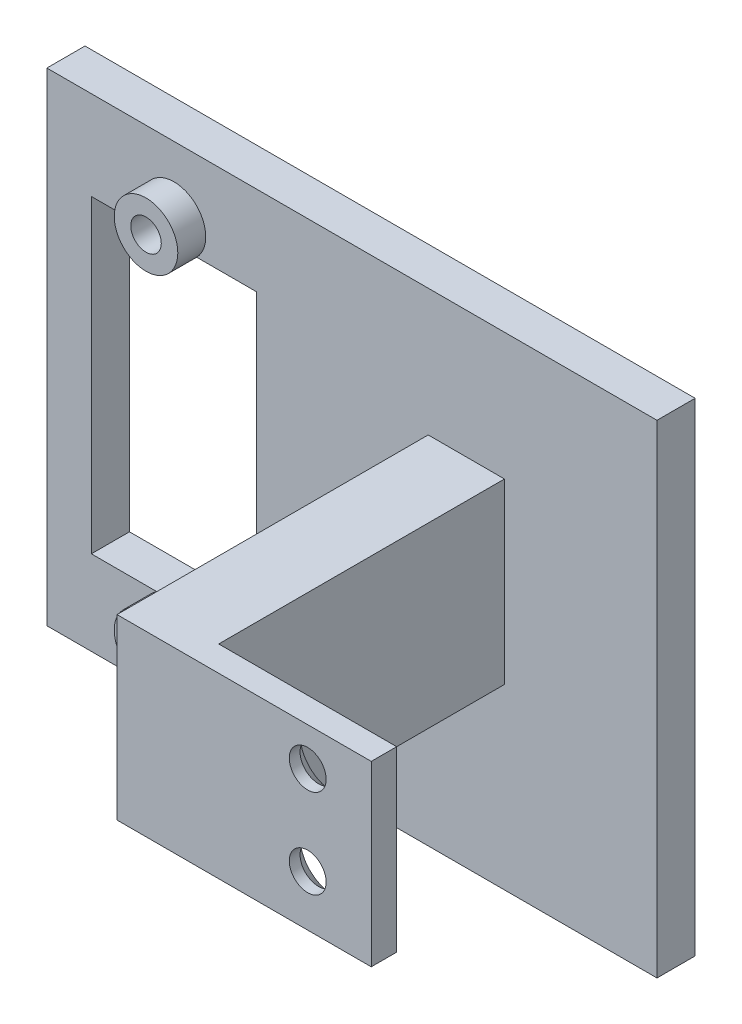
ISO-10303-21;
HEADER;
FILE_DESCRIPTION(('STEP AP214'),'2;1');
FILE_NAME('part.step','',(''),(''),'','','');
FILE_SCHEMA(('AUTOMOTIVE_DESIGN { 1 0 10303 214 1 1 1 1 }'));
ENDSEC;
DATA;
#1=APPLICATION_CONTEXT('core data for automotive mechanical design processes');
#2=APPLICATION_PROTOCOL_DEFINITION('international standard','automotive_design',2000,#1);
#3=PRODUCT_CONTEXT('',#1,'mechanical');
#4=PRODUCT('Part','Part','',(#3));
#5=PRODUCT_RELATED_PRODUCT_CATEGORY('part','',(#4));
#6=PRODUCT_DEFINITION_FORMATION('','',#4);
#7=PRODUCT_DEFINITION_CONTEXT('part definition',#1,'design');
#8=PRODUCT_DEFINITION('design','',#6,#7);
#9=PRODUCT_DEFINITION_SHAPE('','',#8);
#10=(LENGTH_UNIT() NAMED_UNIT(*) SI_UNIT(.MILLI.,.METRE.));
#11=(NAMED_UNIT(*) PLANE_ANGLE_UNIT() SI_UNIT($,.RADIAN.));
#12=(NAMED_UNIT(*) SI_UNIT($,.STERADIAN.) SOLID_ANGLE_UNIT());
#13=UNCERTAINTY_MEASURE_WITH_UNIT(LENGTH_MEASURE(1.E-05),#10,'distance_accuracy_value','');
#14=(GEOMETRIC_REPRESENTATION_CONTEXT(3) GLOBAL_UNCERTAINTY_ASSIGNED_CONTEXT((#13)) GLOBAL_UNIT_ASSIGNED_CONTEXT((#10,
#11,#12)) REPRESENTATION_CONTEXT('',''));
#15=CARTESIAN_POINT('',(0.,0.,0.));
#16=DIRECTION('',(0.,0.,1.));
#17=DIRECTION('',(1.,0.,0.));
#18=AXIS2_PLACEMENT_3D('',#15,#16,#17);
#19=CARTESIAN_POINT('',(-25.,25.,0.01));
#20=DIRECTION('',(0.,0.,-1.));
#21=DIRECTION('',(-1.,0.,0.));
#22=AXIS2_PLACEMENT_3D('',#19,#20,#21);
#23=CYLINDRICAL_SURFACE('',#22,1.45);
#24=CARTESIAN_POINT('',(-25.,25.,0.));
#25=DIRECTION('',(0.,0.,-1.));
#26=DIRECTION('',(-1.,0.,0.));
#27=AXIS2_PLACEMENT_3D('',#24,#25,#26);
#28=CIRCLE('',#27,1.45);
#29=CARTESIAN_POINT('',(-26.45,25.,0.));
#30=VERTEX_POINT('',#29);
#31=EDGE_CURVE('E192',#30,#30,#28,.T.);
#32=ORIENTED_EDGE('',*,*,#31,.F.);
#33=EDGE_LOOP('',(#32));
#34=FACE_BOUND('',#33,.T.);
#35=CARTESIAN_POINT('',(-25.,25.,-0.85));
#36=DIRECTION('',(0.,0.,-1.));
#37=DIRECTION('',(-1.,0.,0.));
#38=AXIS2_PLACEMENT_3D('',#35,#36,#37);
#39=CIRCLE('',#38,1.45);
#40=CARTESIAN_POINT('',(-26.45,25.,-0.85));
#41=VERTEX_POINT('',#40);
#42=EDGE_CURVE('E194',#41,#41,#39,.T.);
#43=ORIENTED_EDGE('',*,*,#42,.T.);
#44=EDGE_LOOP('',(#43));
#45=FACE_BOUND('',#44,.T.);
#46=ADVANCED_FACE('F41',(#34,#45),#23,.F.);
#47=CARTESIAN_POINT('',(-25.,18.,0.01));
#48=DIRECTION('',(0.,0.,-1.));
#49=DIRECTION('',(-1.,0.,0.));
#50=AXIS2_PLACEMENT_3D('',#47,#48,#49);
#51=CYLINDRICAL_SURFACE('',#50,1.45);
#52=CARTESIAN_POINT('',(-25.,18.,0.));
#53=DIRECTION('',(0.,0.,-1.));
#54=DIRECTION('',(-1.,0.,0.));
#55=AXIS2_PLACEMENT_3D('',#52,#53,#54);
#56=CIRCLE('',#55,1.45);
#57=CARTESIAN_POINT('',(-26.45,18.,0.));
#58=VERTEX_POINT('',#57);
#59=EDGE_CURVE('E44',#58,#58,#56,.T.);
#60=ORIENTED_EDGE('',*,*,#59,.F.);
#61=EDGE_LOOP('',(#60));
#62=FACE_BOUND('',#61,.T.);
#63=CARTESIAN_POINT('',(-25.,18.,-0.85));
#64=DIRECTION('',(0.,0.,-1.));
#65=DIRECTION('',(-1.,0.,0.));
#66=AXIS2_PLACEMENT_3D('',#63,#64,#65);
#67=CIRCLE('',#66,1.45);
#68=CARTESIAN_POINT('',(-26.45,18.,-0.85));
#69=VERTEX_POINT('',#68);
#70=EDGE_CURVE('E187',#69,#69,#67,.T.);
#71=ORIENTED_EDGE('',*,*,#70,.T.);
#72=EDGE_LOOP('',(#71));
#73=FACE_BOUND('',#72,.T.);
#74=ADVANCED_FACE('F306',(#62,#73),#51,.F.);
#75=CARTESIAN_POINT('',(0.,0.,-24.480025));
#76=DIRECTION('',(0.,0.,-1.));
#77=DIRECTION('',(-1.,0.,0.));
#78=AXIS2_PLACEMENT_3D('',#75,#76,#77);
#79=PLANE('',#78);
#80=CARTESIAN_POINT('',(-60.,4.55,-24.480025));
#81=DIRECTION('',(0.,0.,1.));
#82=DIRECTION('',(1.,0.,0.));
#83=AXIS2_PLACEMENT_3D('',#80,#81,#82);
#84=CIRCLE('',#83,2.5);
#85=CARTESIAN_POINT('',(-61.3564659966251,6.65,-24.480025));
#86=VERTEX_POINT('',#85);
#87=CARTESIAN_POINT('',(-58.6435340033749,6.65,-24.480025));
#88=VERTEX_POINT('',#87);
#89=EDGE_CURVE('E59',#86,#88,#84,.T.);
#90=ORIENTED_EDGE('',*,*,#89,.F.);
#91=DIRECTION('',(1.,0.,0.));
#92=VECTOR('',#91,1.);
#93=CARTESIAN_POINT('',(-66.5,6.65,-24.480025));
#94=LINE('',#93,#92);
#95=CARTESIAN_POINT('',(-66.5,6.65,-24.480025));
#96=VERTEX_POINT('',#95);
#97=EDGE_CURVE('E236',#96,#86,#94,.T.);
#98=ORIENTED_EDGE('',*,*,#97,.F.);
#99=DIRECTION('',(0.,-1.,0.));
#100=VECTOR('',#99,1.);
#101=CARTESIAN_POINT('',(-66.5,6.65,-24.480025));
#102=LINE('',#101,#100);
#103=CARTESIAN_POINT('',(-66.5,31.,-24.480025));
#104=VERTEX_POINT('',#103);
#105=EDGE_CURVE('E174',#104,#96,#102,.T.);
#106=ORIENTED_EDGE('',*,*,#105,.F.);
#107=DIRECTION('',(-1.,0.,0.));
#108=VECTOR('',#107,1.);
#109=CARTESIAN_POINT('',(-66.5,31.,-24.480025));
#110=LINE('',#109,#108);
#111=CARTESIAN_POINT('',(-61.7853571071357,31.,-24.480025));
#112=VERTEX_POINT('',#111);
#113=EDGE_CURVE('E162',#112,#104,#110,.T.);
#114=ORIENTED_EDGE('',*,*,#113,.F.);
#115=CARTESIAN_POINT('',(-60.,32.75,-24.480025));
#116=DIRECTION('',(0.,0.,1.));
#117=DIRECTION('',(1.,0.,0.));
#118=AXIS2_PLACEMENT_3D('',#115,#116,#117);
#119=CIRCLE('',#118,2.5);
#120=CARTESIAN_POINT('',(-58.2146428928643,31.,-24.480025));
#121=VERTEX_POINT('',#120);
#122=EDGE_CURVE('E65',#121,#112,#119,.T.);
#123=ORIENTED_EDGE('',*,*,#122,.F.);
#124=CARTESIAN_POINT('',(-53.5,31.,-24.480025));
#125=VERTEX_POINT('',#124);
#126=EDGE_CURVE('E163',#125,#121,#110,.T.);
#127=ORIENTED_EDGE('',*,*,#126,.F.);
#128=DIRECTION('',(0.,1.,0.));
#129=VECTOR('',#128,1.);
#130=CARTESIAN_POINT('',(-53.5,6.65,-24.480025));
#131=LINE('',#130,#129);
#132=CARTESIAN_POINT('',(-53.5,6.65,-24.480025));
#133=VERTEX_POINT('',#132);
#134=EDGE_CURVE('E172',#133,#125,#131,.T.);
#135=ORIENTED_EDGE('',*,*,#134,.F.);
#136=EDGE_CURVE('E234',#88,#133,#94,.T.);
#137=ORIENTED_EDGE('',*,*,#136,.F.);
#138=EDGE_LOOP('',(#90,#98,#106,#114,#123,#127,#135,#137));
#139=FACE_BOUND('',#138,.T.);
#140=DIRECTION('',(0.,-1.,0.));
#141=VECTOR('',#140,1.);
#142=CARTESIAN_POINT('',(-70.,0.,-24.480025));
#143=LINE('',#142,#141);
#144=CARTESIAN_POINT('',(-70.,38.,-24.480025));
#145=VERTEX_POINT('',#144);
#146=CARTESIAN_POINT('',(-70.,0.,-24.480025));
#147=VERTEX_POINT('',#146);
#148=EDGE_CURVE('E263',#145,#147,#143,.T.);
#149=ORIENTED_EDGE('',*,*,#148,.T.);
#150=DIRECTION('',(1.,0.,0.));
#151=VECTOR('',#150,1.);
#152=CARTESIAN_POINT('',(-70.,0.,-24.480025));
#153=LINE('',#152,#151);
#154=CARTESIAN_POINT('',(-22.,0.,-24.480025));
#155=VERTEX_POINT('',#154);
#156=EDGE_CURVE('E264',#147,#155,#153,.T.);
#157=ORIENTED_EDGE('',*,*,#156,.T.);
#158=DIRECTION('',(0.,1.,0.));
#159=VECTOR('',#158,1.);
#160=CARTESIAN_POINT('',(-22.,0.,-24.480025));
#161=LINE('',#160,#159);
#162=CARTESIAN_POINT('',(-22.,38.,-24.480025));
#163=VERTEX_POINT('',#162);
#164=EDGE_CURVE('E270',#155,#163,#161,.T.);
#165=ORIENTED_EDGE('',*,*,#164,.T.);
#166=DIRECTION('',(-1.,0.,0.));
#167=VECTOR('',#166,1.);
#168=CARTESIAN_POINT('',(-70.,38.,-24.480025));
#169=LINE('',#168,#167);
#170=EDGE_CURVE('E267',#163,#145,#169,.T.);
#171=ORIENTED_EDGE('',*,*,#170,.T.);
#172=EDGE_LOOP('',(#149,#157,#165,#171));
#173=FACE_BOUND('',#172,.T.);
#174=DIRECTION('',(0.,-1.,0.));
#175=VECTOR('',#174,1.);
#176=CARTESIAN_POINT('',(-40.,0.,-24.480025));
#177=LINE('',#176,#175);
#178=CARTESIAN_POINT('',(-40.,28.,-24.480025));
#179=VERTEX_POINT('',#178);
#180=CARTESIAN_POINT('',(-40.,14.,-24.480025));
#181=VERTEX_POINT('',#180);
#182=EDGE_CURVE('E49',#179,#181,#177,.T.);
#183=ORIENTED_EDGE('',*,*,#182,.F.);
#184=DIRECTION('',(-1.,0.,0.));
#185=VECTOR('',#184,1.);
#186=CARTESIAN_POINT('',(0.,28.,-24.480025));
#187=LINE('',#186,#185);
#188=CARTESIAN_POINT('',(-34.,28.,-24.480025));
#189=VERTEX_POINT('',#188);
#190=EDGE_CURVE('E290',#189,#179,#187,.T.);
#191=ORIENTED_EDGE('',*,*,#190,.F.);
#192=DIRECTION('',(0.,1.,0.));
#193=VECTOR('',#192,1.);
#194=CARTESIAN_POINT('',(-34.,0.,-24.480025));
#195=LINE('',#194,#193);
#196=CARTESIAN_POINT('',(-34.,14.,-24.480025));
#197=VERTEX_POINT('',#196);
#198=EDGE_CURVE('E295',#197,#189,#195,.T.);
#199=ORIENTED_EDGE('',*,*,#198,.F.);
#200=DIRECTION('',(1.,0.,0.));
#201=VECTOR('',#200,1.);
#202=CARTESIAN_POINT('',(0.,14.,-24.480025));
#203=LINE('',#202,#201);
#204=EDGE_CURVE('E298',#181,#197,#203,.T.);
#205=ORIENTED_EDGE('',*,*,#204,.F.);
#206=EDGE_LOOP('',(#183,#191,#199,#205));
#207=FACE_BOUND('',#206,.T.);
#208=ADVANCED_FACE('F167',(#139,#173,#207),#79,.F.);
#209=CARTESIAN_POINT('',(0.,0.,-27.480025));
#210=DIRECTION('',(0.,0.,-1.));
#211=DIRECTION('',(-1.,0.,0.));
#212=AXIS2_PLACEMENT_3D('',#209,#210,#211);
#213=PLANE('',#212);
#214=CARTESIAN_POINT('',(-60.,4.55,-27.480025));
#215=DIRECTION('',(0.,0.,-1.));
#216=DIRECTION('',(-1.,0.,0.));
#217=AXIS2_PLACEMENT_3D('',#214,#215,#216);
#218=CIRCLE('',#217,1.2);
#219=CARTESIAN_POINT('',(-61.2,4.55,-27.480025));
#220=VERTEX_POINT('',#219);
#221=EDGE_CURVE('E404',#220,#220,#218,.T.);
#222=ORIENTED_EDGE('',*,*,#221,.F.);
#223=EDGE_LOOP('',(#222));
#224=FACE_BOUND('',#223,.T.);
#225=CARTESIAN_POINT('',(-60.,32.75,-27.480025));
#226=DIRECTION('',(0.,0.,-1.));
#227=DIRECTION('',(-1.,0.,0.));
#228=AXIS2_PLACEMENT_3D('',#225,#226,#227);
#229=CIRCLE('',#228,1.2);
#230=CARTESIAN_POINT('',(-61.2,32.75,-27.480025));
#231=VERTEX_POINT('',#230);
#232=EDGE_CURVE('E188',#231,#231,#229,.T.);
#233=ORIENTED_EDGE('',*,*,#232,.F.);
#234=EDGE_LOOP('',(#233));
#235=FACE_BOUND('',#234,.T.);
#236=DIRECTION('',(0.,-1.,0.));
#237=VECTOR('',#236,1.);
#238=CARTESIAN_POINT('',(-70.,0.,-27.480025));
#239=LINE('',#238,#237);
#240=CARTESIAN_POINT('',(-70.,38.,-27.480025));
#241=VERTEX_POINT('',#240);
#242=CARTESIAN_POINT('',(-70.,0.,-27.480025));
#243=VERTEX_POINT('',#242);
#244=EDGE_CURVE('E259',#241,#243,#239,.T.);
#245=ORIENTED_EDGE('',*,*,#244,.F.);
#246=DIRECTION('',(-1.,0.,0.));
#247=VECTOR('',#246,1.);
#248=CARTESIAN_POINT('',(-70.,38.,-27.480025));
#249=LINE('',#248,#247);
#250=CARTESIAN_POINT('',(-22.,38.,-27.480025));
#251=VERTEX_POINT('',#250);
#252=EDGE_CURVE('E262',#251,#241,#249,.T.);
#253=ORIENTED_EDGE('',*,*,#252,.F.);
#254=DIRECTION('',(0.,1.,0.));
#255=VECTOR('',#254,1.);
#256=CARTESIAN_POINT('',(-22.,0.,-27.480025));
#257=LINE('',#256,#255);
#258=CARTESIAN_POINT('',(-22.,0.,-27.480025));
#259=VERTEX_POINT('',#258);
#260=EDGE_CURVE('E276',#259,#251,#257,.T.);
#261=ORIENTED_EDGE('',*,*,#260,.F.);
#262=DIRECTION('',(1.,0.,0.));
#263=VECTOR('',#262,1.);
#264=CARTESIAN_POINT('',(-70.,0.,-27.480025));
#265=LINE('',#264,#263);
#266=EDGE_CURVE('E272',#243,#259,#265,.T.);
#267=ORIENTED_EDGE('',*,*,#266,.F.);
#268=EDGE_LOOP('',(#245,#253,#261,#267));
#269=FACE_BOUND('',#268,.T.);
#270=DIRECTION('',(-1.,0.,0.));
#271=VECTOR('',#270,1.);
#272=CARTESIAN_POINT('',(-66.5,31.,-27.480025));
#273=LINE('',#272,#271);
#274=CARTESIAN_POINT('',(-53.5,31.,-27.480025));
#275=VERTEX_POINT('',#274);
#276=CARTESIAN_POINT('',(-66.5,31.,-27.480025));
#277=VERTEX_POINT('',#276);
#278=EDGE_CURVE('E233',#275,#277,#273,.T.);
#279=ORIENTED_EDGE('',*,*,#278,.T.);
#280=DIRECTION('',(0.,-1.,0.));
#281=VECTOR('',#280,1.);
#282=CARTESIAN_POINT('',(-66.5,6.65,-27.480025));
#283=LINE('',#282,#281);
#284=CARTESIAN_POINT('',(-66.5,6.65,-27.480025));
#285=VERTEX_POINT('',#284);
#286=EDGE_CURVE('E235',#277,#285,#283,.T.);
#287=ORIENTED_EDGE('',*,*,#286,.T.);
#288=DIRECTION('',(1.,0.,0.));
#289=VECTOR('',#288,1.);
#290=CARTESIAN_POINT('',(-66.5,6.65,-27.480025));
#291=LINE('',#290,#289);
#292=CARTESIAN_POINT('',(-53.5,6.65,-27.480025));
#293=VERTEX_POINT('',#292);
#294=EDGE_CURVE('E243',#285,#293,#291,.T.);
#295=ORIENTED_EDGE('',*,*,#294,.T.);
#296=DIRECTION('',(0.,1.,0.));
#297=VECTOR('',#296,1.);
#298=CARTESIAN_POINT('',(-53.5,6.65,-27.480025));
#299=LINE('',#298,#297);
#300=EDGE_CURVE('E249',#293,#275,#299,.T.);
#301=ORIENTED_EDGE('',*,*,#300,.T.);
#302=EDGE_LOOP('',(#279,#287,#295,#301));
#303=FACE_BOUND('',#302,.T.);
#304=ADVANCED_FACE('F429',(#224,#235,#269,#303),#213,.T.);
#305=CARTESIAN_POINT('',(-70.,0.,-24.480025));
#306=DIRECTION('',(1.,0.,0.));
#307=DIRECTION('',(0.,0.,-1.));
#308=AXIS2_PLACEMENT_3D('',#305,#306,#307);
#309=PLANE('',#308);
#310=ORIENTED_EDGE('',*,*,#244,.T.);
#311=DIRECTION('',(0.,0.,-1.));
#312=VECTOR('',#311,1.);
#313=CARTESIAN_POINT('',(-70.,0.,-24.480025));
#314=LINE('',#313,#312);
#315=EDGE_CURVE('E287',#147,#243,#314,.T.);
#316=ORIENTED_EDGE('',*,*,#315,.F.);
#317=ORIENTED_EDGE('',*,*,#148,.F.);
#318=DIRECTION('',(0.,0.,-1.));
#319=VECTOR('',#318,1.);
#320=CARTESIAN_POINT('',(-70.,38.,-24.480025));
#321=LINE('',#320,#319);
#322=EDGE_CURVE('E271',#145,#241,#321,.T.);
#323=ORIENTED_EDGE('',*,*,#322,.T.);
#324=EDGE_LOOP('',(#310,#316,#317,#323));
#325=FACE_BOUND('',#324,.T.);
#326=ADVANCED_FACE('F43',(#325),#309,.F.);
#327=CARTESIAN_POINT('',(-70.,0.,-24.480025));
#328=DIRECTION('',(0.,1.,0.));
#329=DIRECTION('',(0.,0.,1.));
#330=AXIS2_PLACEMENT_3D('',#327,#328,#329);
#331=PLANE('',#330);
#332=ORIENTED_EDGE('',*,*,#266,.T.);
#333=DIRECTION('',(0.,0.,-1.));
#334=VECTOR('',#333,1.);
#335=CARTESIAN_POINT('',(-22.,0.,-24.480025));
#336=LINE('',#335,#334);
#337=EDGE_CURVE('E281',#155,#259,#336,.T.);
#338=ORIENTED_EDGE('',*,*,#337,.F.);
#339=ORIENTED_EDGE('',*,*,#156,.F.);
#340=ORIENTED_EDGE('',*,*,#315,.T.);
#341=EDGE_LOOP('',(#332,#338,#339,#340));
#342=FACE_BOUND('',#341,.T.);
#343=ADVANCED_FACE('F454',(#342),#331,.F.);
#344=CARTESIAN_POINT('',(-22.,0.,-24.480025));
#345=DIRECTION('',(-1.,0.,0.));
#346=DIRECTION('',(0.,0.,1.));
#347=AXIS2_PLACEMENT_3D('',#344,#345,#346);
#348=PLANE('',#347);
#349=ORIENTED_EDGE('',*,*,#260,.T.);
#350=DIRECTION('',(0.,0.,-1.));
#351=VECTOR('',#350,1.);
#352=CARTESIAN_POINT('',(-22.,38.,-24.480025));
#353=LINE('',#352,#351);
#354=EDGE_CURVE('E282',#163,#251,#353,.T.);
#355=ORIENTED_EDGE('',*,*,#354,.F.);
#356=ORIENTED_EDGE('',*,*,#164,.F.);
#357=ORIENTED_EDGE('',*,*,#337,.T.);
#358=EDGE_LOOP('',(#349,#355,#356,#357));
#359=FACE_BOUND('',#358,.T.);
#360=ADVANCED_FACE('F445',(#359),#348,.F.);
#361=CARTESIAN_POINT('',(-70.,38.,-24.480025));
#362=DIRECTION('',(0.,-1.,0.));
#363=DIRECTION('',(0.,0.,-1.));
#364=AXIS2_PLACEMENT_3D('',#361,#362,#363);
#365=PLANE('',#364);
#366=ORIENTED_EDGE('',*,*,#252,.T.);
#367=ORIENTED_EDGE('',*,*,#322,.F.);
#368=ORIENTED_EDGE('',*,*,#170,.F.);
#369=ORIENTED_EDGE('',*,*,#354,.T.);
#370=EDGE_LOOP('',(#366,#367,#368,#369));
#371=FACE_BOUND('',#370,.T.);
#372=ADVANCED_FACE('F433',(#371),#365,.F.);
#373=CARTESIAN_POINT('',(-66.5,6.65,-24.480025));
#374=DIRECTION('',(1.,0.,0.));
#375=DIRECTION('',(0.,0.,-1.));
#376=AXIS2_PLACEMENT_3D('',#373,#374,#375);
#377=PLANE('',#376);
#378=ORIENTED_EDGE('',*,*,#286,.F.);
#379=DIRECTION('',(0.,0.,-1.));
#380=VECTOR('',#379,1.);
#381=CARTESIAN_POINT('',(-66.5,31.,-24.480025));
#382=LINE('',#381,#380);
#383=EDGE_CURVE('E244',#104,#277,#382,.T.);
#384=ORIENTED_EDGE('',*,*,#383,.F.);
#385=ORIENTED_EDGE('',*,*,#105,.T.);
#386=DIRECTION('',(0.,0.,-1.));
#387=VECTOR('',#386,1.);
#388=CARTESIAN_POINT('',(-66.5,6.65,-24.480025));
#389=LINE('',#388,#387);
#390=EDGE_CURVE('E257',#96,#285,#389,.T.);
#391=ORIENTED_EDGE('',*,*,#390,.T.);
#392=EDGE_LOOP('',(#378,#384,#385,#391));
#393=FACE_BOUND('',#392,.T.);
#394=ADVANCED_FACE('F434',(#393),#377,.T.);
#395=CARTESIAN_POINT('',(-66.5,6.65,-24.480025));
#396=DIRECTION('',(0.,1.,0.));
#397=DIRECTION('',(0.,0.,1.));
#398=AXIS2_PLACEMENT_3D('',#395,#396,#397);
#399=PLANE('',#398);
#400=ORIENTED_EDGE('',*,*,#294,.F.);
#401=ORIENTED_EDGE('',*,*,#390,.F.);
#402=ORIENTED_EDGE('',*,*,#97,.T.);
#403=EDGE_CURVE('E239',#86,#88,#94,.T.);
#404=ORIENTED_EDGE('',*,*,#403,.T.);
#405=ORIENTED_EDGE('',*,*,#136,.T.);
#406=DIRECTION('',(0.,0.,-1.));
#407=VECTOR('',#406,1.);
#408=CARTESIAN_POINT('',(-53.5,6.65,-24.480025));
#409=LINE('',#408,#407);
#410=EDGE_CURVE('E251',#133,#293,#409,.T.);
#411=ORIENTED_EDGE('',*,*,#410,.T.);
#412=EDGE_LOOP('',(#400,#401,#402,#404,#405,#411));
#413=FACE_BOUND('',#412,.T.);
#414=ADVANCED_FACE('F422',(#413),#399,.T.);
#415=CARTESIAN_POINT('',(-53.5,6.65,-24.480025));
#416=DIRECTION('',(-1.,0.,0.));
#417=DIRECTION('',(0.,0.,1.));
#418=AXIS2_PLACEMENT_3D('',#415,#416,#417);
#419=PLANE('',#418);
#420=ORIENTED_EDGE('',*,*,#300,.F.);
#421=ORIENTED_EDGE('',*,*,#410,.F.);
#422=ORIENTED_EDGE('',*,*,#134,.T.);
#423=DIRECTION('',(0.,0.,-1.));
#424=VECTOR('',#423,1.);
#425=CARTESIAN_POINT('',(-53.5,31.,-24.480025));
#426=LINE('',#425,#424);
#427=EDGE_CURVE('E253',#125,#275,#426,.T.);
#428=ORIENTED_EDGE('',*,*,#427,.T.);
#429=EDGE_LOOP('',(#420,#421,#422,#428));
#430=FACE_BOUND('',#429,.T.);
#431=ADVANCED_FACE('F427',(#430),#419,.T.);
#432=CARTESIAN_POINT('',(-66.5,31.,-24.480025));
#433=DIRECTION('',(0.,-1.,0.));
#434=DIRECTION('',(0.,0.,-1.));
#435=AXIS2_PLACEMENT_3D('',#432,#433,#434);
#436=PLANE('',#435);
#437=ORIENTED_EDGE('',*,*,#278,.F.);
#438=ORIENTED_EDGE('',*,*,#427,.F.);
#439=ORIENTED_EDGE('',*,*,#126,.T.);
#440=EDGE_CURVE('E156',#121,#112,#110,.T.);
#441=ORIENTED_EDGE('',*,*,#440,.T.);
#442=ORIENTED_EDGE('',*,*,#113,.T.);
#443=ORIENTED_EDGE('',*,*,#383,.T.);
#444=EDGE_LOOP('',(#437,#438,#439,#441,#442,#443));
#445=FACE_BOUND('',#444,.T.);
#446=ADVANCED_FACE('F158',(#445),#436,.T.);
#447=CARTESIAN_POINT('',(-40.,14.,-1.));
#448=DIRECTION('',(1.,0.,0.));
#449=DIRECTION('',(0.,0.,-1.));
#450=AXIS2_PLACEMENT_3D('',#447,#448,#449);
#451=PLANE('',#450);
#452=DIRECTION('',(0.,0.,-1.));
#453=VECTOR('',#452,1.);
#454=CARTESIAN_POINT('',(-40.,28.,-1.));
#455=LINE('',#454,#453);
#456=CARTESIAN_POINT('',(-40.,28.,0.));
#457=VERTEX_POINT('',#456);
#458=EDGE_CURVE('E225',#457,#179,#455,.T.);
#459=ORIENTED_EDGE('',*,*,#458,.T.);
#460=ORIENTED_EDGE('',*,*,#182,.T.);
#461=DIRECTION('',(0.,0.,-1.));
#462=VECTOR('',#461,1.);
#463=CARTESIAN_POINT('',(-40.,14.,-1.));
#464=LINE('',#463,#462);
#465=CARTESIAN_POINT('',(-40.,14.,0.));
#466=VERTEX_POINT('',#465);
#467=EDGE_CURVE('E226',#466,#181,#464,.T.);
#468=ORIENTED_EDGE('',*,*,#467,.F.);
#469=DIRECTION('',(0.,-1.,0.));
#470=VECTOR('',#469,1.);
#471=CARTESIAN_POINT('',(-40.,14.,0.));
#472=LINE('',#471,#470);
#473=EDGE_CURVE('E201',#457,#466,#472,.T.);
#474=ORIENTED_EDGE('',*,*,#473,.F.);
#475=EDGE_LOOP('',(#459,#460,#468,#474));
#476=FACE_BOUND('',#475,.T.);
#477=ADVANCED_FACE('F347',(#476),#451,.F.);
#478=CARTESIAN_POINT('',(-40.,14.,-1.));
#479=DIRECTION('',(0.,1.,0.));
#480=DIRECTION('',(0.,0.,1.));
#481=AXIS2_PLACEMENT_3D('',#478,#479,#480);
#482=PLANE('',#481);
#483=DIRECTION('',(0.,0.,-1.));
#484=VECTOR('',#483,1.);
#485=CARTESIAN_POINT('',(-34.,14.,-1.));
#486=LINE('',#485,#484);
#487=CARTESIAN_POINT('',(-34.,14.,-2.));
#488=VERTEX_POINT('',#487);
#489=EDGE_CURVE('E228',#488,#197,#486,.T.);
#490=ORIENTED_EDGE('',*,*,#489,.F.);
#491=DIRECTION('',(1.,0.,0.));
#492=VECTOR('',#491,1.);
#493=CARTESIAN_POINT('',(-40.,14.,-2.));
#494=LINE('',#493,#492);
#495=CARTESIAN_POINT('',(-20.,14.,-2.));
#496=VERTEX_POINT('',#495);
#497=EDGE_CURVE('E214',#488,#496,#494,.T.);
#498=ORIENTED_EDGE('',*,*,#497,.T.);
#499=DIRECTION('',(0.,0.,-1.));
#500=VECTOR('',#499,1.);
#501=CARTESIAN_POINT('',(-20.,14.,0.));
#502=LINE('',#501,#500);
#503=CARTESIAN_POINT('',(-20.,14.,0.));
#504=VERTEX_POINT('',#503);
#505=EDGE_CURVE('E223',#504,#496,#502,.T.);
#506=ORIENTED_EDGE('',*,*,#505,.F.);
#507=DIRECTION('',(1.,0.,0.));
#508=VECTOR('',#507,1.);
#509=CARTESIAN_POINT('',(-40.,14.,0.));
#510=LINE('',#509,#508);
#511=EDGE_CURVE('E203',#466,#504,#510,.T.);
#512=ORIENTED_EDGE('',*,*,#511,.F.);
#513=ORIENTED_EDGE('',*,*,#467,.T.);
#514=ORIENTED_EDGE('',*,*,#204,.T.);
#515=EDGE_LOOP('',(#490,#498,#506,#512,#513,#514));
#516=FACE_BOUND('',#515,.T.);
#517=ADVANCED_FACE('F342',(#516),#482,.F.);
#518=CARTESIAN_POINT('',(-34.,14.,-1.));
#519=DIRECTION('',(-1.,0.,0.));
#520=DIRECTION('',(0.,0.,1.));
#521=AXIS2_PLACEMENT_3D('',#518,#519,#520);
#522=PLANE('',#521);
#523=DIRECTION('',(0.,0.,-1.));
#524=VECTOR('',#523,1.);
#525=CARTESIAN_POINT('',(-34.,28.,-1.));
#526=LINE('',#525,#524);
#527=CARTESIAN_POINT('',(-34.,28.,-2.));
#528=VERTEX_POINT('',#527);
#529=EDGE_CURVE('E227',#528,#189,#526,.T.);
#530=ORIENTED_EDGE('',*,*,#529,.F.);
#531=DIRECTION('',(0.,-1.,0.));
#532=VECTOR('',#531,1.);
#533=CARTESIAN_POINT('',(-34.,14.,-2.));
#534=LINE('',#533,#532);
#535=EDGE_CURVE('E11',#528,#488,#534,.T.);
#536=ORIENTED_EDGE('',*,*,#535,.T.);
#537=ORIENTED_EDGE('',*,*,#489,.T.);
#538=ORIENTED_EDGE('',*,*,#198,.T.);
#539=EDGE_LOOP('',(#530,#536,#537,#538));
#540=FACE_BOUND('',#539,.T.);
#541=ADVANCED_FACE('F336',(#540),#522,.F.);
#542=CARTESIAN_POINT('',(-40.,28.,-1.));
#543=DIRECTION('',(0.,-1.,0.));
#544=DIRECTION('',(0.,0.,-1.));
#545=AXIS2_PLACEMENT_3D('',#542,#543,#544);
#546=PLANE('',#545);
#547=DIRECTION('',(-1.,0.,0.));
#548=VECTOR('',#547,1.);
#549=CARTESIAN_POINT('',(-40.,28.,-2.));
#550=LINE('',#549,#548);
#551=CARTESIAN_POINT('',(-20.,28.,-2.));
#552=VERTEX_POINT('',#551);
#553=EDGE_CURVE('E204',#552,#528,#550,.T.);
#554=ORIENTED_EDGE('',*,*,#553,.T.);
#555=ORIENTED_EDGE('',*,*,#529,.T.);
#556=ORIENTED_EDGE('',*,*,#190,.T.);
#557=ORIENTED_EDGE('',*,*,#458,.F.);
#558=DIRECTION('',(-1.,0.,0.));
#559=VECTOR('',#558,1.);
#560=CARTESIAN_POINT('',(-40.,28.,0.));
#561=LINE('',#560,#559);
#562=CARTESIAN_POINT('',(-20.,28.,0.));
#563=VERTEX_POINT('',#562);
#564=EDGE_CURVE('E206',#563,#457,#561,.T.);
#565=ORIENTED_EDGE('',*,*,#564,.F.);
#566=DIRECTION('',(0.,0.,-1.));
#567=VECTOR('',#566,1.);
#568=CARTESIAN_POINT('',(-20.,28.,0.));
#569=LINE('',#568,#567);
#570=EDGE_CURVE('E212',#563,#552,#569,.T.);
#571=ORIENTED_EDGE('',*,*,#570,.T.);
#572=EDGE_LOOP('',(#554,#555,#556,#557,#565,#571));
#573=FACE_BOUND('',#572,.T.);
#574=ADVANCED_FACE('F321',(#573),#546,.F.);
#575=CARTESIAN_POINT('',(0.,0.,-2.));
#576=DIRECTION('',(0.,0.,-1.));
#577=DIRECTION('',(-1.,0.,0.));
#578=AXIS2_PLACEMENT_3D('',#575,#576,#577);
#579=PLANE('',#578);
#580=CARTESIAN_POINT('',(-25.,18.,-2.));
#581=DIRECTION('',(0.,0.,-1.));
#582=DIRECTION('',(-1.,0.,0.));
#583=AXIS2_PLACEMENT_3D('',#580,#581,#582);
#584=CIRCLE('',#583,2.6);
#585=CARTESIAN_POINT('',(-27.6,18.,-2.));
#586=VERTEX_POINT('',#585);
#587=EDGE_CURVE('E190',#586,#586,#584,.T.);
#588=ORIENTED_EDGE('',*,*,#587,.F.);
#589=EDGE_LOOP('',(#588));
#590=FACE_BOUND('',#589,.T.);
#591=CARTESIAN_POINT('',(-25.,25.,-2.));
#592=DIRECTION('',(0.,0.,-1.));
#593=DIRECTION('',(-1.,0.,0.));
#594=AXIS2_PLACEMENT_3D('',#591,#592,#593);
#595=CIRCLE('',#594,2.6);
#596=CARTESIAN_POINT('',(-27.6,25.,-2.));
#597=VERTEX_POINT('',#596);
#598=EDGE_CURVE('E191',#597,#597,#595,.T.);
#599=ORIENTED_EDGE('',*,*,#598,.F.);
#600=EDGE_LOOP('',(#599));
#601=FACE_BOUND('',#600,.T.);
#602=ORIENTED_EDGE('',*,*,#535,.F.);
#603=ORIENTED_EDGE('',*,*,#553,.F.);
#604=DIRECTION('',(0.,1.,0.));
#605=VECTOR('',#604,1.);
#606=CARTESIAN_POINT('',(-20.,14.,-2.));
#607=LINE('',#606,#605);
#608=EDGE_CURVE('E215',#496,#552,#607,.T.);
#609=ORIENTED_EDGE('',*,*,#608,.F.);
#610=ORIENTED_EDGE('',*,*,#497,.F.);
#611=EDGE_LOOP('',(#602,#603,#609,#610));
#612=FACE_BOUND('',#611,.T.);
#613=ADVANCED_FACE('F323',(#590,#601,#612),#579,.T.);
#614=CARTESIAN_POINT('',(-20.,14.,0.));
#615=DIRECTION('',(-1.,0.,0.));
#616=DIRECTION('',(0.,0.,1.));
#617=AXIS2_PLACEMENT_3D('',#614,#615,#616);
#618=PLANE('',#617);
#619=ORIENTED_EDGE('',*,*,#608,.T.);
#620=ORIENTED_EDGE('',*,*,#570,.F.);
#621=DIRECTION('',(0.,1.,0.));
#622=VECTOR('',#621,1.);
#623=CARTESIAN_POINT('',(-20.,14.,0.));
#624=LINE('',#623,#622);
#625=EDGE_CURVE('E210',#504,#563,#624,.T.);
#626=ORIENTED_EDGE('',*,*,#625,.F.);
#627=ORIENTED_EDGE('',*,*,#505,.T.);
#628=EDGE_LOOP('',(#619,#620,#626,#627));
#629=FACE_BOUND('',#628,.T.);
#630=ADVANCED_FACE('F325',(#629),#618,.F.);
#631=CARTESIAN_POINT('',(0.,0.,0.));
#632=DIRECTION('',(0.,0.,-1.));
#633=DIRECTION('',(-1.,0.,0.));
#634=AXIS2_PLACEMENT_3D('',#631,#632,#633);
#635=PLANE('',#634);
#636=ORIENTED_EDGE('',*,*,#59,.T.);
#637=EDGE_LOOP('',(#636));
#638=FACE_BOUND('',#637,.T.);
#639=ORIENTED_EDGE('',*,*,#31,.T.);
#640=EDGE_LOOP('',(#639));
#641=FACE_BOUND('',#640,.T.);
#642=ORIENTED_EDGE('',*,*,#473,.T.);
#643=ORIENTED_EDGE('',*,*,#511,.T.);
#644=ORIENTED_EDGE('',*,*,#625,.T.);
#645=ORIENTED_EDGE('',*,*,#564,.T.);
#646=EDGE_LOOP('',(#642,#643,#644,#645));
#647=FACE_BOUND('',#646,.T.);
#648=ADVANCED_FACE('F307',(#638,#641,#647),#635,.F.);
#649=CARTESIAN_POINT('',(-25.,18.,-2.));
#650=DIRECTION('',(0.,0.,-1.));
#651=DIRECTION('',(-1.,0.,0.));
#652=AXIS2_PLACEMENT_3D('',#649,#650,#651);
#653=CONICAL_SURFACE('',#652,2.6,0.785398163397448);
#654=ORIENTED_EDGE('',*,*,#70,.F.);
#655=EDGE_LOOP('',(#654));
#656=FACE_BOUND('',#655,.T.);
#657=ORIENTED_EDGE('',*,*,#587,.T.);
#658=EDGE_LOOP('',(#657));
#659=FACE_BOUND('',#658,.T.);
#660=ADVANCED_FACE('F313',(#656,#659),#653,.F.);
#661=CARTESIAN_POINT('',(-25.,25.,-2.));
#662=DIRECTION('',(0.,0.,-1.));
#663=DIRECTION('',(-1.,0.,0.));
#664=AXIS2_PLACEMENT_3D('',#661,#662,#663);
#665=CONICAL_SURFACE('',#664,2.6,0.785398163397448);
#666=ORIENTED_EDGE('',*,*,#42,.F.);
#667=EDGE_LOOP('',(#666));
#668=FACE_BOUND('',#667,.T.);
#669=ORIENTED_EDGE('',*,*,#598,.T.);
#670=EDGE_LOOP('',(#669));
#671=FACE_BOUND('',#670,.T.);
#672=ADVANCED_FACE('F316',(#668,#671),#665,.F.);
#673=CARTESIAN_POINT('',(-60.,32.75,-22.280025));
#674=DIRECTION('',(0.,0.,-1.));
#675=DIRECTION('',(-1.,0.,0.));
#676=AXIS2_PLACEMENT_3D('',#673,#674,#675);
#677=CYLINDRICAL_SURFACE('',#676,2.5);
#678=CARTESIAN_POINT('',(-60.,32.75,-22.280025));
#679=DIRECTION('',(0.,0.,1.));
#680=DIRECTION('',(1.,0.,0.));
#681=AXIS2_PLACEMENT_3D('',#678,#679,#680);
#682=CIRCLE('',#681,2.5);
#683=CARTESIAN_POINT('',(-57.5,32.75,-22.280025));
#684=VERTEX_POINT('',#683);
#685=EDGE_CURVE('E180',#684,#684,#682,.T.);
#686=ORIENTED_EDGE('',*,*,#685,.F.);
#687=EDGE_LOOP('',(#686));
#688=FACE_BOUND('',#687,.T.);
#689=EDGE_CURVE('E177',#112,#121,#119,.T.);
#690=ORIENTED_EDGE('',*,*,#689,.T.);
#691=ORIENTED_EDGE('',*,*,#122,.T.);
#692=EDGE_LOOP('',(#690,#691));
#693=FACE_BOUND('',#692,.T.);
#694=ADVANCED_FACE('F171',(#688,#693),#677,.T.);
#695=CARTESIAN_POINT('',(-60.,32.75,-22.280025));
#696=DIRECTION('',(0.,0.,1.));
#697=DIRECTION('',(1.,0.,0.));
#698=AXIS2_PLACEMENT_3D('',#695,#696,#697);
#699=PLANE('',#698);
#700=CARTESIAN_POINT('',(-60.,32.75,-22.280025));
#701=DIRECTION('',(0.,0.,1.));
#702=DIRECTION('',(1.,0.,0.));
#703=AXIS2_PLACEMENT_3D('',#700,#701,#702);
#704=CIRCLE('',#703,1.2);
#705=CARTESIAN_POINT('',(-58.8,32.75,-22.280025));
#706=VERTEX_POINT('',#705);
#707=EDGE_CURVE('E406',#706,#706,#704,.T.);
#708=ORIENTED_EDGE('',*,*,#707,.F.);
#709=EDGE_LOOP('',(#708));
#710=FACE_BOUND('',#709,.T.);
#711=ORIENTED_EDGE('',*,*,#685,.T.);
#712=EDGE_LOOP('',(#711));
#713=FACE_BOUND('',#712,.T.);
#714=ADVANCED_FACE('F373',(#710,#713),#699,.T.);
#715=CARTESIAN_POINT('',(-60.,32.75,-24.480025));
#716=DIRECTION('',(0.,0.,1.));
#717=DIRECTION('',(1.,0.,0.));
#718=AXIS2_PLACEMENT_3D('',#715,#716,#717);
#719=PLANE('',#718);
#720=ORIENTED_EDGE('',*,*,#440,.F.);
#721=ORIENTED_EDGE('',*,*,#689,.F.);
#722=EDGE_LOOP('',(#720,#721));
#723=FACE_BOUND('',#722,.T.);
#724=ADVANCED_FACE('F179',(#723),#719,.F.);
#725=CARTESIAN_POINT('',(-60.,4.55,-22.280025));
#726=DIRECTION('',(0.,0.,-1.));
#727=DIRECTION('',(-1.,0.,0.));
#728=AXIS2_PLACEMENT_3D('',#725,#726,#727);
#729=CYLINDRICAL_SURFACE('',#728,2.5);
#730=CARTESIAN_POINT('',(-60.,4.55,-22.280025));
#731=DIRECTION('',(0.,0.,1.));
#732=DIRECTION('',(1.,0.,0.));
#733=AXIS2_PLACEMENT_3D('',#730,#731,#732);
#734=CIRCLE('',#733,2.5);
#735=CARTESIAN_POINT('',(-57.5,4.55,-22.280025));
#736=VERTEX_POINT('',#735);
#737=EDGE_CURVE('E198',#736,#736,#734,.T.);
#738=ORIENTED_EDGE('',*,*,#737,.F.);
#739=EDGE_LOOP('',(#738));
#740=FACE_BOUND('',#739,.T.);
#741=EDGE_CURVE('E176',#88,#86,#84,.T.);
#742=ORIENTED_EDGE('',*,*,#741,.T.);
#743=ORIENTED_EDGE('',*,*,#89,.T.);
#744=EDGE_LOOP('',(#742,#743));
#745=FACE_BOUND('',#744,.T.);
#746=ADVANCED_FACE('F380',(#740,#745),#729,.T.);
#747=CARTESIAN_POINT('',(-60.,4.55,-22.280025));
#748=DIRECTION('',(0.,0.,1.));
#749=DIRECTION('',(1.,0.,0.));
#750=AXIS2_PLACEMENT_3D('',#747,#748,#749);
#751=PLANE('',#750);
#752=CARTESIAN_POINT('',(-60.,4.55,-22.280025));
#753=DIRECTION('',(0.,0.,1.));
#754=DIRECTION('',(1.,0.,0.));
#755=AXIS2_PLACEMENT_3D('',#752,#753,#754);
#756=CIRCLE('',#755,1.2);
#757=CARTESIAN_POINT('',(-58.8,4.55,-22.280025));
#758=VERTEX_POINT('',#757);
#759=EDGE_CURVE('E407',#758,#758,#756,.T.);
#760=ORIENTED_EDGE('',*,*,#759,.F.);
#761=EDGE_LOOP('',(#760));
#762=FACE_BOUND('',#761,.T.);
#763=ORIENTED_EDGE('',*,*,#737,.T.);
#764=EDGE_LOOP('',(#763));
#765=FACE_BOUND('',#764,.T.);
#766=ADVANCED_FACE('F381',(#762,#765),#751,.T.);
#767=CARTESIAN_POINT('',(-60.,4.55,-24.480025));
#768=DIRECTION('',(0.,0.,1.));
#769=DIRECTION('',(1.,0.,0.));
#770=AXIS2_PLACEMENT_3D('',#767,#768,#769);
#771=PLANE('',#770);
#772=ORIENTED_EDGE('',*,*,#403,.F.);
#773=ORIENTED_EDGE('',*,*,#741,.F.);
#774=EDGE_LOOP('',(#772,#773));
#775=FACE_BOUND('',#774,.T.);
#776=ADVANCED_FACE('F383',(#775),#771,.F.);
#777=CARTESIAN_POINT('',(-60.,4.55,-27.490025));
#778=DIRECTION('',(0.,0.,1.));
#779=DIRECTION('',(1.,0.,0.));
#780=AXIS2_PLACEMENT_3D('',#777,#778,#779);
#781=CYLINDRICAL_SURFACE('',#780,1.2);
#782=ORIENTED_EDGE('',*,*,#221,.T.);
#783=EDGE_LOOP('',(#782));
#784=FACE_BOUND('',#783,.T.);
#785=ORIENTED_EDGE('',*,*,#759,.T.);
#786=EDGE_LOOP('',(#785));
#787=FACE_BOUND('',#786,.T.);
#788=ADVANCED_FACE('F389',(#784,#787),#781,.F.);
#789=CARTESIAN_POINT('',(-60.,32.75,-27.490025));
#790=DIRECTION('',(0.,0.,1.));
#791=DIRECTION('',(1.,0.,0.));
#792=AXIS2_PLACEMENT_3D('',#789,#790,#791);
#793=CYLINDRICAL_SURFACE('',#792,1.2);
#794=ORIENTED_EDGE('',*,*,#232,.T.);
#795=EDGE_LOOP('',(#794));
#796=FACE_BOUND('',#795,.T.);
#797=ORIENTED_EDGE('',*,*,#707,.T.);
#798=EDGE_LOOP('',(#797));
#799=FACE_BOUND('',#798,.T.);
#800=ADVANCED_FACE('F395',(#796,#799),#793,.F.);
#801=CLOSED_SHELL('',(#46,#74,#208,#304,#326,#343,#360,#372,#394,#414,#431,#446,#477,#517,#541,
#574,#613,#630,#648,#660,#672,#694,#714,#724,#746,#766,#776,#788,#800));
#802=MANIFOLD_SOLID_BREP('B2',#801);
#803=ADVANCED_BREP_SHAPE_REPRESENTATION('',(#18,#802),#14);
#804=SHAPE_DEFINITION_REPRESENTATION(#9,#803);
ENDSEC;
END-ISO-10303-21;
